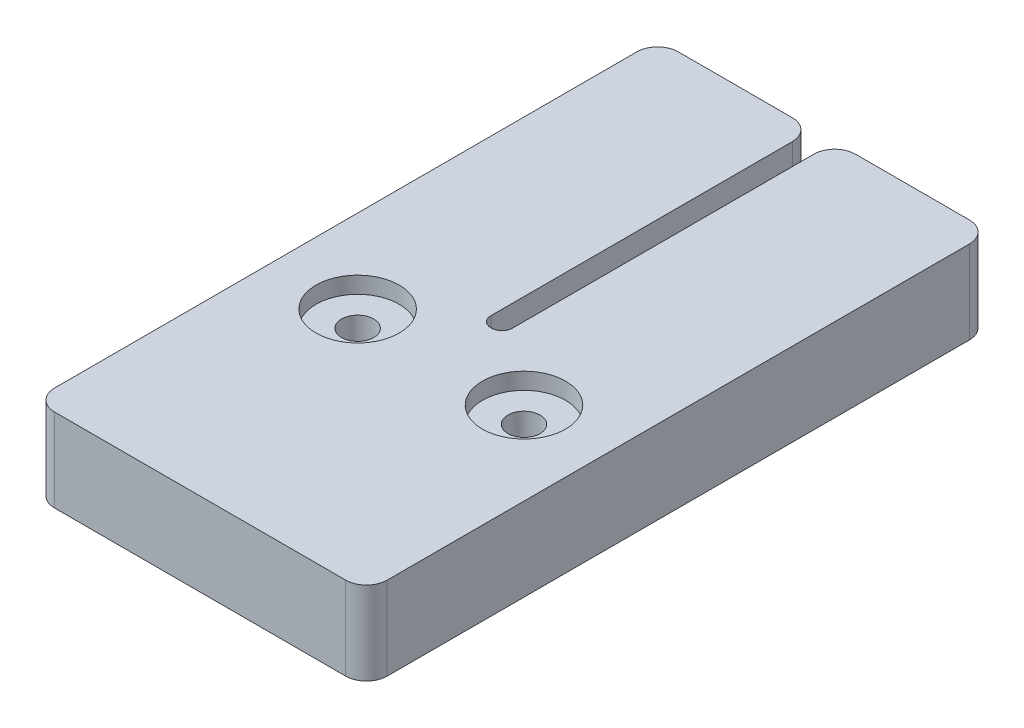
ISO-10303-21;
HEADER;
FILE_DESCRIPTION(('STEP AP214'),'2;1');
FILE_NAME('part.step','',(''),(''),'','','');
FILE_SCHEMA(('AUTOMOTIVE_DESIGN { 1 0 10303 214 1 1 1 1 }'));
ENDSEC;
DATA;
#1=APPLICATION_CONTEXT('core data for automotive mechanical design processes');
#2=APPLICATION_PROTOCOL_DEFINITION('international standard','automotive_design',2000,#1);
#3=PRODUCT_CONTEXT('',#1,'mechanical');
#4=PRODUCT('Part','Part','',(#3));
#5=PRODUCT_RELATED_PRODUCT_CATEGORY('part','',(#4));
#6=PRODUCT_DEFINITION_FORMATION('','',#4);
#7=PRODUCT_DEFINITION_CONTEXT('part definition',#1,'design');
#8=PRODUCT_DEFINITION('design','',#6,#7);
#9=PRODUCT_DEFINITION_SHAPE('','',#8);
#10=(LENGTH_UNIT() NAMED_UNIT(*) SI_UNIT(.MILLI.,.METRE.));
#11=(NAMED_UNIT(*) PLANE_ANGLE_UNIT() SI_UNIT($,.RADIAN.));
#12=(NAMED_UNIT(*) SI_UNIT($,.STERADIAN.) SOLID_ANGLE_UNIT());
#13=UNCERTAINTY_MEASURE_WITH_UNIT(LENGTH_MEASURE(1.E-05),#10,'distance_accuracy_value','');
#14=(GEOMETRIC_REPRESENTATION_CONTEXT(3) GLOBAL_UNCERTAINTY_ASSIGNED_CONTEXT((#13)) GLOBAL_UNIT_ASSIGNED_CONTEXT((#10,
#11,#12)) REPRESENTATION_CONTEXT('',''));
#15=CARTESIAN_POINT('',(0.,0.,0.));
#16=DIRECTION('',(0.,0.,1.));
#17=DIRECTION('',(1.,0.,0.));
#18=AXIS2_PLACEMENT_3D('',#15,#16,#17);
#19=CARTESIAN_POINT('',(12.7,12.7,-36.7538));
#20=DIRECTION('',(0.,-1.,0.));
#21=DIRECTION('',(0.,0.,-1.));
#22=AXIS2_PLACEMENT_3D('',#19,#20,#21);
#23=CYLINDRICAL_SURFACE('',#22,2.45745);
#24=CARTESIAN_POINT('',(12.7,0.,-36.7538));
#25=DIRECTION('',(0.,-1.,0.));
#26=DIRECTION('',(0.,0.,-1.));
#27=AXIS2_PLACEMENT_3D('',#24,#25,#26);
#28=CIRCLE('',#27,2.45745);
#29=CARTESIAN_POINT('',(12.7,0.,-39.21125));
#30=VERTEX_POINT('',#29);
#31=EDGE_CURVE('E301',#30,#30,#28,.T.);
#32=ORIENTED_EDGE('',*,*,#31,.T.);
#33=EDGE_LOOP('',(#32));
#34=FACE_BOUND('',#33,.T.);
#35=CARTESIAN_POINT('',(12.7,10.16,-36.7538));
#36=DIRECTION('',(0.,1.,0.));
#37=DIRECTION('',(0.,0.,1.));
#38=AXIS2_PLACEMENT_3D('',#35,#36,#37);
#39=CIRCLE('',#38,2.45745);
#40=CARTESIAN_POINT('',(12.7,10.16,-34.29635));
#41=VERTEX_POINT('',#40);
#42=EDGE_CURVE('E49',#41,#41,#39,.F.);
#43=ORIENTED_EDGE('',*,*,#42,.F.);
#44=EDGE_LOOP('',(#43));
#45=FACE_BOUND('',#44,.T.);
#46=ADVANCED_FACE('F45',(#34,#45),#23,.F.);
#47=CARTESIAN_POINT('',(-12.7,12.7,-36.7538));
#48=DIRECTION('',(0.,-1.,0.));
#49=DIRECTION('',(0.,0.,-1.));
#50=AXIS2_PLACEMENT_3D('',#47,#48,#49);
#51=CYLINDRICAL_SURFACE('',#50,2.45745);
#52=CARTESIAN_POINT('',(-12.7,0.,-36.7538));
#53=DIRECTION('',(0.,-1.,0.));
#54=DIRECTION('',(0.,0.,-1.));
#55=AXIS2_PLACEMENT_3D('',#52,#53,#54);
#56=CIRCLE('',#55,2.45745);
#57=CARTESIAN_POINT('',(-12.7,0.,-39.21125));
#58=VERTEX_POINT('',#57);
#59=EDGE_CURVE('E320',#58,#58,#56,.T.);
#60=ORIENTED_EDGE('',*,*,#59,.T.);
#61=EDGE_LOOP('',(#60));
#62=FACE_BOUND('',#61,.T.);
#63=CARTESIAN_POINT('',(-12.7,10.16,-36.7538));
#64=DIRECTION('',(0.,1.,0.));
#65=DIRECTION('',(0.,0.,1.));
#66=AXIS2_PLACEMENT_3D('',#63,#64,#65);
#67=CIRCLE('',#66,2.45745);
#68=CARTESIAN_POINT('',(-12.7,10.16,-34.29635));
#69=VERTEX_POINT('',#68);
#70=EDGE_CURVE('E291',#69,#69,#67,.F.);
#71=ORIENTED_EDGE('',*,*,#70,.F.);
#72=EDGE_LOOP('',(#71));
#73=FACE_BOUND('',#72,.T.);
#74=ADVANCED_FACE('F390',(#62,#73),#51,.F.);
#75=CARTESIAN_POINT('',(-25.4,12.7,-95.25));
#76=DIRECTION('',(1.,0.,0.));
#77=DIRECTION('',(0.,0.,-1.));
#78=AXIS2_PLACEMENT_3D('',#75,#76,#77);
#79=PLANE('',#78);
#80=DIRECTION('',(0.,0.,1.));
#81=VECTOR('',#80,1.);
#82=CARTESIAN_POINT('',(-25.4,12.7,-95.25));
#83=LINE('',#82,#81);
#84=CARTESIAN_POINT('',(-25.4,12.7,-92.075));
#85=VERTEX_POINT('',#84);
#86=CARTESIAN_POINT('',(-25.4,12.7,-3.175));
#87=VERTEX_POINT('',#86);
#88=EDGE_CURVE('E200',#85,#87,#83,.T.);
#89=ORIENTED_EDGE('',*,*,#88,.F.);
#90=DIRECTION('',(0.,-1.,0.));
#91=VECTOR('',#90,1.);
#92=CARTESIAN_POINT('',(-25.4,12.7,-92.075));
#93=LINE('',#92,#91);
#94=CARTESIAN_POINT('',(-25.4,0.,-92.075));
#95=VERTEX_POINT('',#94);
#96=EDGE_CURVE('E253',#85,#95,#93,.T.);
#97=ORIENTED_EDGE('',*,*,#96,.T.);
#98=DIRECTION('',(0.,0.,1.));
#99=VECTOR('',#98,1.);
#100=CARTESIAN_POINT('',(-25.4,0.,-95.25));
#101=LINE('',#100,#99);
#102=CARTESIAN_POINT('',(-25.4,0.,-3.175));
#103=VERTEX_POINT('',#102);
#104=EDGE_CURVE('E324',#95,#103,#101,.T.);
#105=ORIENTED_EDGE('',*,*,#104,.T.);
#106=DIRECTION('',(0.,-1.,0.));
#107=VECTOR('',#106,1.);
#108=CARTESIAN_POINT('',(-25.4,12.7,-3.175));
#109=LINE('',#108,#107);
#110=EDGE_CURVE('E250',#103,#87,#109,.F.);
#111=ORIENTED_EDGE('',*,*,#110,.T.);
#112=EDGE_LOOP('',(#89,#97,#105,#111));
#113=FACE_BOUND('',#112,.T.);
#114=ADVANCED_FACE('F396',(#113),#79,.F.);
#115=CARTESIAN_POINT('',(-25.4,12.7,0.));
#116=DIRECTION('',(0.,0.,-1.));
#117=DIRECTION('',(-1.,0.,0.));
#118=AXIS2_PLACEMENT_3D('',#115,#116,#117);
#119=PLANE('',#118);
#120=DIRECTION('',(1.,0.,0.));
#121=VECTOR('',#120,1.);
#122=CARTESIAN_POINT('',(-25.4,12.7,0.));
#123=LINE('',#122,#121);
#124=CARTESIAN_POINT('',(-22.225,12.7,0.));
#125=VERTEX_POINT('',#124);
#126=CARTESIAN_POINT('',(22.225,12.7,0.));
#127=VERTEX_POINT('',#126);
#128=EDGE_CURVE('E331',#125,#127,#123,.T.);
#129=ORIENTED_EDGE('',*,*,#128,.F.);
#130=DIRECTION('',(0.,-1.,0.));
#131=VECTOR('',#130,1.);
#132=CARTESIAN_POINT('',(-22.225,12.7,0.));
#133=LINE('',#132,#131);
#134=CARTESIAN_POINT('',(-22.225,0.,0.));
#135=VERTEX_POINT('',#134);
#136=EDGE_CURVE('E267',#125,#135,#133,.T.);
#137=ORIENTED_EDGE('',*,*,#136,.T.);
#138=DIRECTION('',(1.,0.,0.));
#139=VECTOR('',#138,1.);
#140=CARTESIAN_POINT('',(-25.4,0.,0.));
#141=LINE('',#140,#139);
#142=CARTESIAN_POINT('',(22.225,0.,0.));
#143=VERTEX_POINT('',#142);
#144=EDGE_CURVE('E358',#135,#143,#141,.T.);
#145=ORIENTED_EDGE('',*,*,#144,.T.);
#146=DIRECTION('',(0.,-1.,0.));
#147=VECTOR('',#146,1.);
#148=CARTESIAN_POINT('',(22.225,12.7,0.));
#149=LINE('',#148,#147);
#150=EDGE_CURVE('E264',#143,#127,#149,.F.);
#151=ORIENTED_EDGE('',*,*,#150,.T.);
#152=EDGE_LOOP('',(#129,#137,#145,#151));
#153=FACE_BOUND('',#152,.T.);
#154=ADVANCED_FACE('F387',(#153),#119,.F.);
#155=CARTESIAN_POINT('',(25.4,12.7,0.));
#156=DIRECTION('',(-1.,0.,0.));
#157=DIRECTION('',(0.,0.,1.));
#158=AXIS2_PLACEMENT_3D('',#155,#156,#157);
#159=PLANE('',#158);
#160=DIRECTION('',(0.,0.,-1.));
#161=VECTOR('',#160,1.);
#162=CARTESIAN_POINT('',(25.4,0.,0.));
#163=LINE('',#162,#161);
#164=CARTESIAN_POINT('',(25.4,0.,-3.175));
#165=VERTEX_POINT('',#164);
#166=CARTESIAN_POINT('',(25.4,0.,-92.075));
#167=VERTEX_POINT('',#166);
#168=EDGE_CURVE('E191',#165,#167,#163,.T.);
#169=ORIENTED_EDGE('',*,*,#168,.T.);
#170=DIRECTION('',(0.,-1.,0.));
#171=VECTOR('',#170,1.);
#172=CARTESIAN_POINT('',(25.4,12.7,-92.075));
#173=LINE('',#172,#171);
#174=CARTESIAN_POINT('',(25.4,12.7,-92.075));
#175=VERTEX_POINT('',#174);
#176=EDGE_CURVE('E261',#167,#175,#173,.F.);
#177=ORIENTED_EDGE('',*,*,#176,.T.);
#178=DIRECTION('',(0.,0.,-1.));
#179=VECTOR('',#178,1.);
#180=CARTESIAN_POINT('',(25.4,12.7,0.));
#181=LINE('',#180,#179);
#182=CARTESIAN_POINT('',(25.4,12.7,-3.175));
#183=VERTEX_POINT('',#182);
#184=EDGE_CURVE('E335',#183,#175,#181,.T.);
#185=ORIENTED_EDGE('',*,*,#184,.F.);
#186=DIRECTION('',(0.,-1.,0.));
#187=VECTOR('',#186,1.);
#188=CARTESIAN_POINT('',(25.4,12.7,-3.175));
#189=LINE('',#188,#187);
#190=EDGE_CURVE('E257',#183,#165,#189,.T.);
#191=ORIENTED_EDGE('',*,*,#190,.T.);
#192=EDGE_LOOP('',(#169,#177,#185,#191));
#193=FACE_BOUND('',#192,.T.);
#194=ADVANCED_FACE('F367',(#193),#159,.F.);
#195=CARTESIAN_POINT('',(25.4,12.7,-95.25));
#196=DIRECTION('',(0.,0.,1.));
#197=DIRECTION('',(1.,0.,0.));
#198=AXIS2_PLACEMENT_3D('',#195,#196,#197);
#199=PLANE('',#198);
#200=DIRECTION('',(-1.,0.,0.));
#201=VECTOR('',#200,1.);
#202=CARTESIAN_POINT('',(25.4,0.,-95.25));
#203=LINE('',#202,#201);
#204=CARTESIAN_POINT('',(22.225,0.,-95.25));
#205=VERTEX_POINT('',#204);
#206=CARTESIAN_POINT('',(4.826,0.,-95.25));
#207=VERTEX_POINT('',#206);
#208=EDGE_CURVE('E183',#205,#207,#203,.T.);
#209=ORIENTED_EDGE('',*,*,#208,.T.);
#210=DIRECTION('',(0.,-1.,0.));
#211=VECTOR('',#210,1.);
#212=CARTESIAN_POINT('',(4.826,12.7,-95.25));
#213=LINE('',#212,#211);
#214=CARTESIAN_POINT('',(4.826,12.7,-95.25));
#215=VERTEX_POINT('',#214);
#216=EDGE_CURVE('E166',#207,#215,#213,.F.);
#217=ORIENTED_EDGE('',*,*,#216,.T.);
#218=DIRECTION('',(-1.,0.,0.));
#219=VECTOR('',#218,1.);
#220=CARTESIAN_POINT('',(25.4,12.7,-95.25));
#221=LINE('',#220,#219);
#222=CARTESIAN_POINT('',(22.225,12.7,-95.25));
#223=VERTEX_POINT('',#222);
#224=EDGE_CURVE('E339',#223,#215,#221,.T.);
#225=ORIENTED_EDGE('',*,*,#224,.F.);
#226=DIRECTION('',(0.,-1.,0.));
#227=VECTOR('',#226,1.);
#228=CARTESIAN_POINT('',(22.225,12.7,-95.25));
#229=LINE('',#228,#227);
#230=EDGE_CURVE('E170',#223,#205,#229,.T.);
#231=ORIENTED_EDGE('',*,*,#230,.T.);
#232=EDGE_LOOP('',(#209,#217,#225,#231));
#233=FACE_BOUND('',#232,.T.);
#234=ADVANCED_FACE('F378',(#233),#199,.F.);
#235=CARTESIAN_POINT('',(1.65099999999999,12.7,-44.45));
#236=DIRECTION('',(1.,0.,0.));
#237=DIRECTION('',(0.,0.,-1.));
#238=AXIS2_PLACEMENT_3D('',#235,#236,#237);
#239=PLANE('',#238);
#240=DIRECTION('',(0.,0.,1.));
#241=VECTOR('',#240,1.);
#242=CARTESIAN_POINT('',(1.65099999999999,0.,-44.45));
#243=LINE('',#242,#241);
#244=CARTESIAN_POINT('',(1.651,0.,-92.075));
#245=VERTEX_POINT('',#244);
#246=CARTESIAN_POINT('',(1.65099999999999,0.,-46.0375));
#247=VERTEX_POINT('',#246);
#248=EDGE_CURVE('E174',#245,#247,#243,.T.);
#249=ORIENTED_EDGE('',*,*,#248,.T.);
#250=DIRECTION('',(0.,-1.,0.));
#251=VECTOR('',#250,1.);
#252=CARTESIAN_POINT('',(1.65099999999999,12.7,-46.0375));
#253=LINE('',#252,#251);
#254=CARTESIAN_POINT('',(1.65099999999999,12.7,-46.0375));
#255=VERTEX_POINT('',#254);
#256=EDGE_CURVE('E69',#247,#255,#253,.F.);
#257=ORIENTED_EDGE('',*,*,#256,.T.);
#258=DIRECTION('',(0.,0.,1.));
#259=VECTOR('',#258,1.);
#260=CARTESIAN_POINT('',(1.65099999999999,12.7,-44.45));
#261=LINE('',#260,#259);
#262=CARTESIAN_POINT('',(1.651,12.7,-92.075));
#263=VERTEX_POINT('',#262);
#264=EDGE_CURVE('E175',#263,#255,#261,.T.);
#265=ORIENTED_EDGE('',*,*,#264,.F.);
#266=DIRECTION('',(0.,-1.,0.));
#267=VECTOR('',#266,1.);
#268=CARTESIAN_POINT('',(1.651,12.7,-92.075));
#269=LINE('',#268,#267);
#270=EDGE_CURVE('E165',#263,#245,#269,.T.);
#271=ORIENTED_EDGE('',*,*,#270,.T.);
#272=EDGE_LOOP('',(#249,#257,#265,#271));
#273=FACE_BOUND('',#272,.T.);
#274=ADVANCED_FACE('F173',(#273),#239,.F.);
#275=CARTESIAN_POINT('',(-1.65099999999999,12.7,-44.45));
#276=DIRECTION('',(0.,0.,1.));
#277=DIRECTION('',(1.,0.,0.));
#278=AXIS2_PLACEMENT_3D('',#275,#276,#277);
#279=PLANE('',#278);
#280=DIRECTION('',(-1.,0.,0.));
#281=VECTOR('',#280,1.);
#282=CARTESIAN_POINT('',(-1.65099999999999,0.,-44.45));
#283=LINE('',#282,#281);
#284=CARTESIAN_POINT('',(0.0634999999999939,0.,-44.45));
#285=VERTEX_POINT('',#284);
#286=CARTESIAN_POINT('',(-0.0634999999999939,0.,-44.45));
#287=VERTEX_POINT('',#286);
#288=EDGE_CURVE('E182',#285,#287,#283,.T.);
#289=ORIENTED_EDGE('',*,*,#288,.T.);
#290=DIRECTION('',(0.,-1.,0.));
#291=VECTOR('',#290,1.);
#292=CARTESIAN_POINT('',(-0.0634999999999939,12.7,-44.45));
#293=LINE('',#292,#291);
#294=CARTESIAN_POINT('',(-0.0634999999999939,12.7,-44.45));
#295=VERTEX_POINT('',#294);
#296=EDGE_CURVE('E279',#287,#295,#293,.F.);
#297=ORIENTED_EDGE('',*,*,#296,.T.);
#298=DIRECTION('',(-1.,0.,0.));
#299=VECTOR('',#298,1.);
#300=CARTESIAN_POINT('',(-1.65099999999999,12.7,-44.45));
#301=LINE('',#300,#299);
#302=CARTESIAN_POINT('',(0.0634999999999939,12.7,-44.45));
#303=VERTEX_POINT('',#302);
#304=EDGE_CURVE('E345',#303,#295,#301,.T.);
#305=ORIENTED_EDGE('',*,*,#304,.F.);
#306=DIRECTION('',(0.,-1.,0.));
#307=VECTOR('',#306,1.);
#308=CARTESIAN_POINT('',(0.0634999999999939,0.,-44.45));
#309=LINE('',#308,#307);
#310=EDGE_CURVE('E275',#303,#285,#309,.T.);
#311=ORIENTED_EDGE('',*,*,#310,.T.);
#312=EDGE_LOOP('',(#289,#297,#305,#311));
#313=FACE_BOUND('',#312,.T.);
#314=ADVANCED_FACE('F385',(#313),#279,.F.);
#315=CARTESIAN_POINT('',(-1.651,12.7,-95.25));
#316=DIRECTION('',(-1.,0.,0.));
#317=DIRECTION('',(0.,0.,1.));
#318=AXIS2_PLACEMENT_3D('',#315,#316,#317);
#319=PLANE('',#318);
#320=DIRECTION('',(0.,0.,-1.));
#321=VECTOR('',#320,1.);
#322=CARTESIAN_POINT('',(-1.651,12.7,-95.25));
#323=LINE('',#322,#321);
#324=CARTESIAN_POINT('',(-1.65099999999999,12.7,-46.0375));
#325=VERTEX_POINT('',#324);
#326=CARTESIAN_POINT('',(-1.651,12.7,-92.075));
#327=VERTEX_POINT('',#326);
#328=EDGE_CURVE('E349',#325,#327,#323,.T.);
#329=ORIENTED_EDGE('',*,*,#328,.F.);
#330=DIRECTION('',(0.,-1.,0.));
#331=VECTOR('',#330,1.);
#332=CARTESIAN_POINT('',(-1.65099999999999,0.,-46.0375));
#333=LINE('',#332,#331);
#334=CARTESIAN_POINT('',(-1.65099999999999,0.,-46.0375));
#335=VERTEX_POINT('',#334);
#336=EDGE_CURVE('E271',#325,#335,#333,.T.);
#337=ORIENTED_EDGE('',*,*,#336,.T.);
#338=DIRECTION('',(0.,0.,-1.));
#339=VECTOR('',#338,1.);
#340=CARTESIAN_POINT('',(-1.651,0.,-95.25));
#341=LINE('',#340,#339);
#342=CARTESIAN_POINT('',(-1.651,0.,-92.075));
#343=VERTEX_POINT('',#342);
#344=EDGE_CURVE('E189',#335,#343,#341,.T.);
#345=ORIENTED_EDGE('',*,*,#344,.T.);
#346=DIRECTION('',(0.,-1.,0.));
#347=VECTOR('',#346,1.);
#348=CARTESIAN_POINT('',(-1.651,12.7,-92.075));
#349=LINE('',#348,#347);
#350=EDGE_CURVE('E246',#343,#327,#349,.F.);
#351=ORIENTED_EDGE('',*,*,#350,.T.);
#352=EDGE_LOOP('',(#329,#337,#345,#351));
#353=FACE_BOUND('',#352,.T.);
#354=ADVANCED_FACE('F411',(#353),#319,.F.);
#355=CARTESIAN_POINT('',(-1.651,12.7,-95.25));
#356=DIRECTION('',(0.,0.,1.));
#357=DIRECTION('',(1.,0.,0.));
#358=AXIS2_PLACEMENT_3D('',#355,#356,#357);
#359=PLANE('',#358);
#360=DIRECTION('',(-1.,0.,0.));
#361=VECTOR('',#360,1.);
#362=CARTESIAN_POINT('',(-1.651,12.7,-95.25));
#363=LINE('',#362,#361);
#364=CARTESIAN_POINT('',(-4.826,12.7,-95.25));
#365=VERTEX_POINT('',#364);
#366=CARTESIAN_POINT('',(-22.225,12.7,-95.25));
#367=VERTEX_POINT('',#366);
#368=EDGE_CURVE('E178',#365,#367,#363,.T.);
#369=ORIENTED_EDGE('',*,*,#368,.F.);
#370=DIRECTION('',(0.,-1.,0.));
#371=VECTOR('',#370,1.);
#372=CARTESIAN_POINT('',(-4.826,12.7,-95.25));
#373=LINE('',#372,#371);
#374=CARTESIAN_POINT('',(-4.826,0.,-95.25));
#375=VERTEX_POINT('',#374);
#376=EDGE_CURVE('E242',#365,#375,#373,.T.);
#377=ORIENTED_EDGE('',*,*,#376,.T.);
#378=DIRECTION('',(-1.,0.,0.));
#379=VECTOR('',#378,1.);
#380=CARTESIAN_POINT('',(-1.651,0.,-95.25));
#381=LINE('',#380,#379);
#382=CARTESIAN_POINT('',(-22.225,0.,-95.25));
#383=VERTEX_POINT('',#382);
#384=EDGE_CURVE('E197',#375,#383,#381,.T.);
#385=ORIENTED_EDGE('',*,*,#384,.T.);
#386=DIRECTION('',(0.,-1.,0.));
#387=VECTOR('',#386,1.);
#388=CARTESIAN_POINT('',(-22.225,12.7,-95.25));
#389=LINE('',#388,#387);
#390=EDGE_CURVE('E239',#383,#367,#389,.F.);
#391=ORIENTED_EDGE('',*,*,#390,.T.);
#392=EDGE_LOOP('',(#369,#377,#385,#391));
#393=FACE_BOUND('',#392,.T.);
#394=ADVANCED_FACE('F404',(#393),#359,.F.);
#395=CARTESIAN_POINT('',(0.,12.7,0.));
#396=DIRECTION('',(0.,1.,0.));
#397=DIRECTION('',(0.,0.,1.));
#398=AXIS2_PLACEMENT_3D('',#395,#396,#397);
#399=PLANE('',#398);
#400=CARTESIAN_POINT('',(12.7,12.7,-36.7538));
#401=DIRECTION('',(0.,1.,0.));
#402=DIRECTION('',(0.,0.,1.));
#403=AXIS2_PLACEMENT_3D('',#400,#401,#402);
#404=CIRCLE('',#403,6.35);
#405=CARTESIAN_POINT('',(12.7,12.7,-30.4038));
#406=VERTEX_POINT('',#405);
#407=EDGE_CURVE('E303',#406,#406,#404,.T.);
#408=ORIENTED_EDGE('',*,*,#407,.F.);
#409=EDGE_LOOP('',(#408));
#410=FACE_BOUND('',#409,.T.);
#411=CARTESIAN_POINT('',(-12.7,12.7,-36.7538));
#412=DIRECTION('',(0.,1.,0.));
#413=DIRECTION('',(0.,0.,1.));
#414=AXIS2_PLACEMENT_3D('',#411,#412,#413);
#415=CIRCLE('',#414,6.35);
#416=CARTESIAN_POINT('',(-12.7,12.7,-30.4038));
#417=VERTEX_POINT('',#416);
#418=EDGE_CURVE('E316',#417,#417,#415,.T.);
#419=ORIENTED_EDGE('',*,*,#418,.F.);
#420=EDGE_LOOP('',(#419));
#421=FACE_BOUND('',#420,.T.);
#422=ORIENTED_EDGE('',*,*,#224,.T.);
#423=CARTESIAN_POINT('',(4.826,12.7,-92.075));
#424=DIRECTION('',(0.,1.,0.));
#425=DIRECTION('',(0.,0.,1.));
#426=AXIS2_PLACEMENT_3D('',#423,#424,#425);
#427=CIRCLE('',#426,3.175);
#428=EDGE_CURVE('E236',#215,#263,#427,.T.);
#429=ORIENTED_EDGE('',*,*,#428,.T.);
#430=ORIENTED_EDGE('',*,*,#264,.T.);
#431=CARTESIAN_POINT('',(0.0634999999999939,12.7,-46.0375));
#432=DIRECTION('',(0.,1.,0.));
#433=DIRECTION('',(0.,0.,1.));
#434=AXIS2_PLACEMENT_3D('',#431,#432,#433);
#435=CIRCLE('',#434,1.5875);
#436=EDGE_CURVE('E11',#255,#303,#435,.F.);
#437=ORIENTED_EDGE('',*,*,#436,.T.);
#438=ORIENTED_EDGE('',*,*,#304,.T.);
#439=CARTESIAN_POINT('',(-0.0634999999999939,12.7,-46.0375));
#440=DIRECTION('',(0.,1.,0.));
#441=DIRECTION('',(0.,0.,1.));
#442=AXIS2_PLACEMENT_3D('',#439,#440,#441);
#443=CIRCLE('',#442,1.5875);
#444=EDGE_CURVE('E287',#295,#325,#443,.F.);
#445=ORIENTED_EDGE('',*,*,#444,.T.);
#446=ORIENTED_EDGE('',*,*,#328,.T.);
#447=CARTESIAN_POINT('',(-4.826,12.7,-92.075));
#448=DIRECTION('',(0.,1.,0.));
#449=DIRECTION('',(0.,0.,1.));
#450=AXIS2_PLACEMENT_3D('',#447,#448,#449);
#451=CIRCLE('',#450,3.175);
#452=EDGE_CURVE('E233',#327,#365,#451,.T.);
#453=ORIENTED_EDGE('',*,*,#452,.T.);
#454=ORIENTED_EDGE('',*,*,#368,.T.);
#455=CARTESIAN_POINT('',(-22.225,12.7,-92.075));
#456=DIRECTION('',(0.,1.,0.));
#457=DIRECTION('',(0.,0.,1.));
#458=AXIS2_PLACEMENT_3D('',#455,#456,#457);
#459=CIRCLE('',#458,3.175);
#460=EDGE_CURVE('E230',#367,#85,#459,.T.);
#461=ORIENTED_EDGE('',*,*,#460,.T.);
#462=ORIENTED_EDGE('',*,*,#88,.T.);
#463=CARTESIAN_POINT('',(-22.225,12.7,-3.175));
#464=DIRECTION('',(0.,1.,0.));
#465=DIRECTION('',(0.,0.,1.));
#466=AXIS2_PLACEMENT_3D('',#463,#464,#465);
#467=CIRCLE('',#466,3.175);
#468=EDGE_CURVE('E224',#87,#125,#467,.T.);
#469=ORIENTED_EDGE('',*,*,#468,.T.);
#470=ORIENTED_EDGE('',*,*,#128,.T.);
#471=CARTESIAN_POINT('',(22.225,12.7,-3.175));
#472=DIRECTION('',(0.,1.,0.));
#473=DIRECTION('',(0.,0.,1.));
#474=AXIS2_PLACEMENT_3D('',#471,#472,#473);
#475=CIRCLE('',#474,3.175);
#476=EDGE_CURVE('E221',#127,#183,#475,.T.);
#477=ORIENTED_EDGE('',*,*,#476,.T.);
#478=ORIENTED_EDGE('',*,*,#184,.T.);
#479=CARTESIAN_POINT('',(22.225,12.7,-92.075));
#480=DIRECTION('',(0.,1.,0.));
#481=DIRECTION('',(0.,0.,1.));
#482=AXIS2_PLACEMENT_3D('',#479,#480,#481);
#483=CIRCLE('',#482,3.175);
#484=EDGE_CURVE('E227',#175,#223,#483,.T.);
#485=ORIENTED_EDGE('',*,*,#484,.T.);
#486=EDGE_LOOP('',(#422,#429,#430,#437,#438,#445,#446,#453,#454,#461,#462,#469,#470,#477,#478,#485));
#487=FACE_BOUND('',#486,.T.);
#488=ADVANCED_FACE('F376',(#410,#421,#487),#399,.T.);
#489=CARTESIAN_POINT('',(0.,0.,0.));
#490=DIRECTION('',(0.,1.,0.));
#491=DIRECTION('',(0.,0.,1.));
#492=AXIS2_PLACEMENT_3D('',#489,#490,#491);
#493=PLANE('',#492);
#494=ORIENTED_EDGE('',*,*,#59,.F.);
#495=EDGE_LOOP('',(#494));
#496=FACE_BOUND('',#495,.T.);
#497=ORIENTED_EDGE('',*,*,#31,.F.);
#498=EDGE_LOOP('',(#497));
#499=FACE_BOUND('',#498,.T.);
#500=ORIENTED_EDGE('',*,*,#248,.F.);
#501=CARTESIAN_POINT('',(4.826,0.,-92.075));
#502=DIRECTION('',(0.,1.,0.));
#503=DIRECTION('',(0.,0.,1.));
#504=AXIS2_PLACEMENT_3D('',#501,#502,#503);
#505=CIRCLE('',#504,3.175);
#506=EDGE_CURVE('E161',#245,#207,#505,.F.);
#507=ORIENTED_EDGE('',*,*,#506,.T.);
#508=ORIENTED_EDGE('',*,*,#208,.F.);
#509=CARTESIAN_POINT('',(22.225,0.,-92.075));
#510=DIRECTION('',(0.,1.,0.));
#511=DIRECTION('',(0.,0.,1.));
#512=AXIS2_PLACEMENT_3D('',#509,#510,#511);
#513=CIRCLE('',#512,3.175);
#514=EDGE_CURVE('E207',#205,#167,#513,.F.);
#515=ORIENTED_EDGE('',*,*,#514,.T.);
#516=ORIENTED_EDGE('',*,*,#168,.F.);
#517=CARTESIAN_POINT('',(22.225,0.,-3.175));
#518=DIRECTION('',(0.,1.,0.));
#519=DIRECTION('',(0.,0.,1.));
#520=AXIS2_PLACEMENT_3D('',#517,#518,#519);
#521=CIRCLE('',#520,3.175);
#522=EDGE_CURVE('E177',#165,#143,#521,.F.);
#523=ORIENTED_EDGE('',*,*,#522,.T.);
#524=ORIENTED_EDGE('',*,*,#144,.F.);
#525=CARTESIAN_POINT('',(-22.225,0.,-3.175));
#526=DIRECTION('',(0.,1.,0.));
#527=DIRECTION('',(0.,0.,1.));
#528=AXIS2_PLACEMENT_3D('',#525,#526,#527);
#529=CIRCLE('',#528,3.175);
#530=EDGE_CURVE('E204',#135,#103,#529,.F.);
#531=ORIENTED_EDGE('',*,*,#530,.T.);
#532=ORIENTED_EDGE('',*,*,#104,.F.);
#533=CARTESIAN_POINT('',(-22.225,0.,-92.075));
#534=DIRECTION('',(0.,1.,0.));
#535=DIRECTION('',(0.,0.,1.));
#536=AXIS2_PLACEMENT_3D('',#533,#534,#535);
#537=CIRCLE('',#536,3.175);
#538=EDGE_CURVE('E210',#95,#383,#537,.F.);
#539=ORIENTED_EDGE('',*,*,#538,.T.);
#540=ORIENTED_EDGE('',*,*,#384,.F.);
#541=CARTESIAN_POINT('',(-4.826,0.,-92.075));
#542=DIRECTION('',(0.,1.,0.));
#543=DIRECTION('',(0.,0.,1.));
#544=AXIS2_PLACEMENT_3D('',#541,#542,#543);
#545=CIRCLE('',#544,3.175);
#546=EDGE_CURVE('E171',#375,#343,#545,.F.);
#547=ORIENTED_EDGE('',*,*,#546,.T.);
#548=ORIENTED_EDGE('',*,*,#344,.F.);
#549=CARTESIAN_POINT('',(-0.0634999999999939,0.,-46.0375));
#550=DIRECTION('',(0.,1.,0.));
#551=DIRECTION('',(0.,0.,1.));
#552=AXIS2_PLACEMENT_3D('',#549,#550,#551);
#553=CIRCLE('',#552,1.5875);
#554=EDGE_CURVE('E284',#335,#287,#553,.T.);
#555=ORIENTED_EDGE('',*,*,#554,.T.);
#556=ORIENTED_EDGE('',*,*,#288,.F.);
#557=CARTESIAN_POINT('',(0.0634999999999939,0.,-46.0375));
#558=DIRECTION('',(0.,1.,0.));
#559=DIRECTION('',(0.,0.,1.));
#560=AXIS2_PLACEMENT_3D('',#557,#558,#559);
#561=CIRCLE('',#560,1.5875);
#562=EDGE_CURVE('E55',#285,#247,#561,.T.);
#563=ORIENTED_EDGE('',*,*,#562,.T.);
#564=EDGE_LOOP('',(#500,#507,#508,#515,#516,#523,#524,#531,#532,#539,#540,#547,#548,#555,#556,#563));
#565=FACE_BOUND('',#564,.T.);
#566=ADVANCED_FACE('F180',(#496,#499,#565),#493,.F.);
#567=CARTESIAN_POINT('',(4.826,12.7,-92.075));
#568=DIRECTION('',(0.,-1.,0.));
#569=DIRECTION('',(0.,0.,-1.));
#570=AXIS2_PLACEMENT_3D('',#567,#568,#569);
#571=CYLINDRICAL_SURFACE('',#570,3.175);
#572=ORIENTED_EDGE('',*,*,#428,.F.);
#573=ORIENTED_EDGE('',*,*,#216,.F.);
#574=ORIENTED_EDGE('',*,*,#506,.F.);
#575=ORIENTED_EDGE('',*,*,#270,.F.);
#576=EDGE_LOOP('',(#572,#573,#574,#575));
#577=FACE_BOUND('',#576,.T.);
#578=ADVANCED_FACE('F164',(#577),#571,.T.);
#579=CARTESIAN_POINT('',(-4.826,12.7,-92.075));
#580=DIRECTION('',(0.,-1.,0.));
#581=DIRECTION('',(0.,0.,-1.));
#582=AXIS2_PLACEMENT_3D('',#579,#580,#581);
#583=CYLINDRICAL_SURFACE('',#582,3.175);
#584=ORIENTED_EDGE('',*,*,#452,.F.);
#585=ORIENTED_EDGE('',*,*,#350,.F.);
#586=ORIENTED_EDGE('',*,*,#546,.F.);
#587=ORIENTED_EDGE('',*,*,#376,.F.);
#588=EDGE_LOOP('',(#584,#585,#586,#587));
#589=FACE_BOUND('',#588,.T.);
#590=ADVANCED_FACE('F433',(#589),#583,.T.);
#591=CARTESIAN_POINT('',(-22.225,12.7,-92.075));
#592=DIRECTION('',(0.,-1.,0.));
#593=DIRECTION('',(0.,0.,-1.));
#594=AXIS2_PLACEMENT_3D('',#591,#592,#593);
#595=CYLINDRICAL_SURFACE('',#594,3.175);
#596=ORIENTED_EDGE('',*,*,#460,.F.);
#597=ORIENTED_EDGE('',*,*,#390,.F.);
#598=ORIENTED_EDGE('',*,*,#538,.F.);
#599=ORIENTED_EDGE('',*,*,#96,.F.);
#600=EDGE_LOOP('',(#596,#597,#598,#599));
#601=FACE_BOUND('',#600,.T.);
#602=ADVANCED_FACE('F439',(#601),#595,.T.);
#603=CARTESIAN_POINT('',(22.225,12.7,-92.075));
#604=DIRECTION('',(0.,-1.,0.));
#605=DIRECTION('',(0.,0.,-1.));
#606=AXIS2_PLACEMENT_3D('',#603,#604,#605);
#607=CYLINDRICAL_SURFACE('',#606,3.175);
#608=ORIENTED_EDGE('',*,*,#484,.F.);
#609=ORIENTED_EDGE('',*,*,#176,.F.);
#610=ORIENTED_EDGE('',*,*,#514,.F.);
#611=ORIENTED_EDGE('',*,*,#230,.F.);
#612=EDGE_LOOP('',(#608,#609,#610,#611));
#613=FACE_BOUND('',#612,.T.);
#614=ADVANCED_FACE('F372',(#613),#607,.T.);
#615=CARTESIAN_POINT('',(-22.225,12.7,-3.175));
#616=DIRECTION('',(0.,-1.,0.));
#617=DIRECTION('',(0.,0.,-1.));
#618=AXIS2_PLACEMENT_3D('',#615,#616,#617);
#619=CYLINDRICAL_SURFACE('',#618,3.175);
#620=ORIENTED_EDGE('',*,*,#468,.F.);
#621=ORIENTED_EDGE('',*,*,#110,.F.);
#622=ORIENTED_EDGE('',*,*,#530,.F.);
#623=ORIENTED_EDGE('',*,*,#136,.F.);
#624=EDGE_LOOP('',(#620,#621,#622,#623));
#625=FACE_BOUND('',#624,.T.);
#626=ADVANCED_FACE('F447',(#625),#619,.T.);
#627=CARTESIAN_POINT('',(22.225,12.7,-3.175));
#628=DIRECTION('',(0.,-1.,0.));
#629=DIRECTION('',(0.,0.,-1.));
#630=AXIS2_PLACEMENT_3D('',#627,#628,#629);
#631=CYLINDRICAL_SURFACE('',#630,3.175);
#632=ORIENTED_EDGE('',*,*,#476,.F.);
#633=ORIENTED_EDGE('',*,*,#150,.F.);
#634=ORIENTED_EDGE('',*,*,#522,.F.);
#635=ORIENTED_EDGE('',*,*,#190,.F.);
#636=EDGE_LOOP('',(#632,#633,#634,#635));
#637=FACE_BOUND('',#636,.T.);
#638=ADVANCED_FACE('F455',(#637),#631,.T.);
#639=CARTESIAN_POINT('',(-0.0634999999999939,12.7,-46.0375));
#640=DIRECTION('',(0.,1.,0.));
#641=DIRECTION('',(0.,0.,1.));
#642=AXIS2_PLACEMENT_3D('',#639,#640,#641);
#643=CYLINDRICAL_SURFACE('',#642,1.5875);
#644=ORIENTED_EDGE('',*,*,#444,.F.);
#645=ORIENTED_EDGE('',*,*,#296,.F.);
#646=ORIENTED_EDGE('',*,*,#554,.F.);
#647=ORIENTED_EDGE('',*,*,#336,.F.);
#648=EDGE_LOOP('',(#644,#645,#646,#647));
#649=FACE_BOUND('',#648,.T.);
#650=ADVANCED_FACE('F425',(#649),#643,.F.);
#651=CARTESIAN_POINT('',(0.0634999999999939,12.7,-46.0375));
#652=DIRECTION('',(0.,1.,0.));
#653=DIRECTION('',(0.,0.,1.));
#654=AXIS2_PLACEMENT_3D('',#651,#652,#653);
#655=CYLINDRICAL_SURFACE('',#654,1.5875);
#656=ORIENTED_EDGE('',*,*,#436,.F.);
#657=ORIENTED_EDGE('',*,*,#256,.F.);
#658=ORIENTED_EDGE('',*,*,#562,.F.);
#659=ORIENTED_EDGE('',*,*,#310,.F.);
#660=EDGE_LOOP('',(#656,#657,#658,#659));
#661=FACE_BOUND('',#660,.T.);
#662=ADVANCED_FACE('F47',(#661),#655,.F.);
#663=CARTESIAN_POINT('',(-12.7,10.16,-36.7538));
#664=DIRECTION('',(0.,1.,0.));
#665=DIRECTION('',(0.,0.,1.));
#666=AXIS2_PLACEMENT_3D('',#663,#664,#665);
#667=PLANE('',#666);
#668=CARTESIAN_POINT('',(-12.7,10.16,-36.7538));
#669=DIRECTION('',(0.,1.,0.));
#670=DIRECTION('',(0.,0.,1.));
#671=AXIS2_PLACEMENT_3D('',#668,#669,#670);
#672=CIRCLE('',#671,6.35);
#673=CARTESIAN_POINT('',(-12.7,10.16,-30.4038));
#674=VERTEX_POINT('',#673);
#675=EDGE_CURVE('E310',#674,#674,#672,.T.);
#676=ORIENTED_EDGE('',*,*,#675,.T.);
#677=EDGE_LOOP('',(#676));
#678=FACE_BOUND('',#677,.T.);
#679=ORIENTED_EDGE('',*,*,#70,.T.);
#680=EDGE_LOOP('',(#679));
#681=FACE_BOUND('',#680,.T.);
#682=ADVANCED_FACE('F560',(#678,#681),#667,.T.);
#683=CARTESIAN_POINT('',(-12.7,10.16,-36.7538));
#684=DIRECTION('',(0.,1.,0.));
#685=DIRECTION('',(0.,0.,1.));
#686=AXIS2_PLACEMENT_3D('',#683,#684,#685);
#687=CYLINDRICAL_SURFACE('',#686,6.35);
#688=ORIENTED_EDGE('',*,*,#675,.F.);
#689=EDGE_LOOP('',(#688));
#690=FACE_BOUND('',#689,.T.);
#691=ORIENTED_EDGE('',*,*,#418,.T.);
#692=EDGE_LOOP('',(#691));
#693=FACE_BOUND('',#692,.T.);
#694=ADVANCED_FACE('F589',(#690,#693),#687,.F.);
#695=CARTESIAN_POINT('',(12.7,10.16,-36.7538));
#696=DIRECTION('',(0.,1.,0.));
#697=DIRECTION('',(0.,0.,1.));
#698=AXIS2_PLACEMENT_3D('',#695,#696,#697);
#699=PLANE('',#698);
#700=CARTESIAN_POINT('',(12.7,10.16,-36.7538));
#701=DIRECTION('',(0.,1.,0.));
#702=DIRECTION('',(0.,0.,1.));
#703=AXIS2_PLACEMENT_3D('',#700,#701,#702);
#704=CIRCLE('',#703,6.35);
#705=CARTESIAN_POINT('',(12.7,10.16,-30.4038));
#706=VERTEX_POINT('',#705);
#707=EDGE_CURVE('E294',#706,#706,#704,.T.);
#708=ORIENTED_EDGE('',*,*,#707,.T.);
#709=EDGE_LOOP('',(#708));
#710=FACE_BOUND('',#709,.T.);
#711=ORIENTED_EDGE('',*,*,#42,.T.);
#712=EDGE_LOOP('',(#711));
#713=FACE_BOUND('',#712,.T.);
#714=ADVANCED_FACE('F599',(#710,#713),#699,.T.);
#715=CARTESIAN_POINT('',(12.7,10.16,-36.7538));
#716=DIRECTION('',(0.,1.,0.));
#717=DIRECTION('',(0.,0.,1.));
#718=AXIS2_PLACEMENT_3D('',#715,#716,#717);
#719=CYLINDRICAL_SURFACE('',#718,6.35);
#720=ORIENTED_EDGE('',*,*,#707,.F.);
#721=EDGE_LOOP('',(#720));
#722=FACE_BOUND('',#721,.T.);
#723=ORIENTED_EDGE('',*,*,#407,.T.);
#724=EDGE_LOOP('',(#723));
#725=FACE_BOUND('',#724,.T.);
#726=ADVANCED_FACE('F608',(#722,#725),#719,.F.);
#727=CLOSED_SHELL('',(#46,#74,#114,#154,#194,#234,#274,#314,#354,#394,#488,#566,#578,#590,#602,
#614,#626,#638,#650,#662,#682,#694,#714,#726));
#728=MANIFOLD_SOLID_BREP('B2',#727);
#729=ADVANCED_BREP_SHAPE_REPRESENTATION('',(#18,#728),#14);
#730=SHAPE_DEFINITION_REPRESENTATION(#9,#729);
ENDSEC;
END-ISO-10303-21;
